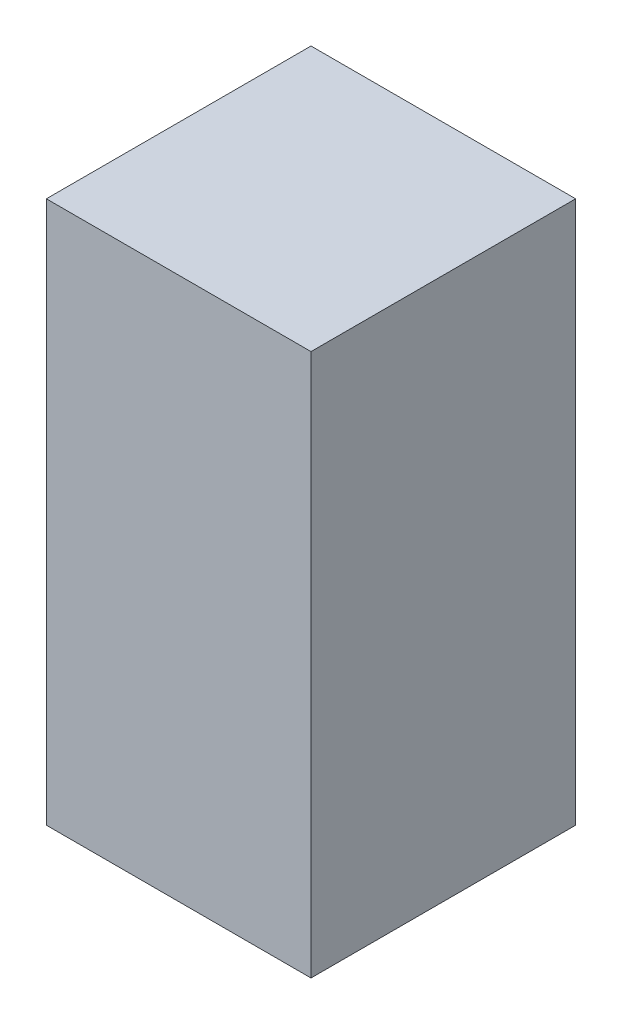
ISO-10303-21;
HEADER;
FILE_DESCRIPTION(('STEP AP214'),'2;1');
FILE_NAME('part.step','',(''),(''),'','','');
FILE_SCHEMA(('AUTOMOTIVE_DESIGN { 1 0 10303 214 1 1 1 1 }'));
ENDSEC;
DATA;
#1=APPLICATION_CONTEXT('core data for automotive mechanical design processes');
#2=APPLICATION_PROTOCOL_DEFINITION('international standard','automotive_design',2000,#1);
#3=PRODUCT_CONTEXT('',#1,'mechanical');
#4=PRODUCT('Part','Part','',(#3));
#5=PRODUCT_RELATED_PRODUCT_CATEGORY('part','',(#4));
#6=PRODUCT_DEFINITION_FORMATION('','',#4);
#7=PRODUCT_DEFINITION_CONTEXT('part definition',#1,'design');
#8=PRODUCT_DEFINITION('design','',#6,#7);
#9=PRODUCT_DEFINITION_SHAPE('','',#8);
#10=(LENGTH_UNIT() NAMED_UNIT(*) SI_UNIT(.MILLI.,.METRE.));
#11=(NAMED_UNIT(*) PLANE_ANGLE_UNIT() SI_UNIT($,.RADIAN.));
#12=(NAMED_UNIT(*) SI_UNIT($,.STERADIAN.) SOLID_ANGLE_UNIT());
#13=UNCERTAINTY_MEASURE_WITH_UNIT(LENGTH_MEASURE(1.E-05),#10,'distance_accuracy_value','');
#14=(GEOMETRIC_REPRESENTATION_CONTEXT(3) GLOBAL_UNCERTAINTY_ASSIGNED_CONTEXT((#13)) GLOBAL_UNIT_ASSIGNED_CONTEXT((#10,
#11,#12)) REPRESENTATION_CONTEXT('',''));
#15=CARTESIAN_POINT('',(0.,0.,0.));
#16=DIRECTION('',(0.,0.,1.));
#17=DIRECTION('',(1.,0.,0.));
#18=AXIS2_PLACEMENT_3D('',#15,#16,#17);
#19=CARTESIAN_POINT('',(2.,2.05,-1.));
#20=DIRECTION('',(0.,0.,1.));
#21=DIRECTION('',(0.,-1.,0.));
#22=AXIS2_PLACEMENT_3D('',#19,#20,#21);
#23=PLANE('',#22);
#24=DIRECTION('',(0.,1.,0.));
#25=VECTOR('',#24,1.);
#26=CARTESIAN_POINT('',(0.,2.05,-1.));
#27=LINE('',#26,#25);
#28=CARTESIAN_POINT('',(0.,-2.05,-1.));
#29=VERTEX_POINT('',#28);
#30=CARTESIAN_POINT('',(0.,2.05,-1.));
#31=VERTEX_POINT('',#30);
#32=EDGE_CURVE('E100',#29,#31,#27,.T.);
#33=ORIENTED_EDGE('',*,*,#32,.T.);
#34=DIRECTION('',(-1.,0.,0.));
#35=VECTOR('',#34,1.);
#36=CARTESIAN_POINT('',(2.,2.05,-1.));
#37=LINE('',#36,#35);
#38=CARTESIAN_POINT('',(2.,2.05,-1.));
#39=VERTEX_POINT('',#38);
#40=EDGE_CURVE('E11',#39,#31,#37,.T.);
#41=ORIENTED_EDGE('',*,*,#40,.F.);
#42=DIRECTION('',(0.,1.,0.));
#43=VECTOR('',#42,1.);
#44=CARTESIAN_POINT('',(2.,2.05,-1.));
#45=LINE('',#44,#43);
#46=CARTESIAN_POINT('',(2.,-2.05,-1.));
#47=VERTEX_POINT('',#46);
#48=EDGE_CURVE('E88',#47,#39,#45,.T.);
#49=ORIENTED_EDGE('',*,*,#48,.F.);
#50=DIRECTION('',(-1.,0.,0.));
#51=VECTOR('',#50,1.);
#52=CARTESIAN_POINT('',(2.,-2.05,-1.));
#53=LINE('',#52,#51);
#54=EDGE_CURVE('E96',#47,#29,#53,.T.);
#55=ORIENTED_EDGE('',*,*,#54,.T.);
#56=EDGE_LOOP('',(#33,#41,#49,#55));
#57=FACE_BOUND('',#56,.T.);
#58=ADVANCED_FACE('F37',(#57),#23,.F.);
#59=CARTESIAN_POINT('',(2.,2.05,1.));
#60=DIRECTION('',(0.,-1.,0.));
#61=DIRECTION('',(0.,0.,-1.));
#62=AXIS2_PLACEMENT_3D('',#59,#60,#61);
#63=PLANE('',#62);
#64=DIRECTION('',(0.,0.,1.));
#65=VECTOR('',#64,1.);
#66=CARTESIAN_POINT('',(0.,2.05,1.));
#67=LINE('',#66,#65);
#68=CARTESIAN_POINT('',(0.,2.05,1.));
#69=VERTEX_POINT('',#68);
#70=EDGE_CURVE('E92',#31,#69,#67,.T.);
#71=ORIENTED_EDGE('',*,*,#70,.T.);
#72=DIRECTION('',(-1.,0.,0.));
#73=VECTOR('',#72,1.);
#74=CARTESIAN_POINT('',(2.,2.05,1.));
#75=LINE('',#74,#73);
#76=CARTESIAN_POINT('',(2.,2.05,1.));
#77=VERTEX_POINT('',#76);
#78=EDGE_CURVE('E45',#77,#69,#75,.T.);
#79=ORIENTED_EDGE('',*,*,#78,.F.);
#80=DIRECTION('',(0.,0.,1.));
#81=VECTOR('',#80,1.);
#82=CARTESIAN_POINT('',(2.,2.05,1.));
#83=LINE('',#82,#81);
#84=EDGE_CURVE('E83',#39,#77,#83,.T.);
#85=ORIENTED_EDGE('',*,*,#84,.F.);
#86=ORIENTED_EDGE('',*,*,#40,.T.);
#87=EDGE_LOOP('',(#71,#79,#85,#86));
#88=FACE_BOUND('',#87,.T.);
#89=ADVANCED_FACE('F91',(#88),#63,.F.);
#90=CARTESIAN_POINT('',(2.,2.05,1.));
#91=DIRECTION('',(0.,0.,-1.));
#92=DIRECTION('',(0.,1.,0.));
#93=AXIS2_PLACEMENT_3D('',#90,#91,#92);
#94=PLANE('',#93);
#95=DIRECTION('',(0.,-1.,0.));
#96=VECTOR('',#95,1.);
#97=CARTESIAN_POINT('',(0.,2.05,1.));
#98=LINE('',#97,#96);
#99=CARTESIAN_POINT('',(0.,-2.05,1.));
#100=VERTEX_POINT('',#99);
#101=EDGE_CURVE('E70',#69,#100,#98,.T.);
#102=ORIENTED_EDGE('',*,*,#101,.T.);
#103=DIRECTION('',(-1.,0.,0.));
#104=VECTOR('',#103,1.);
#105=CARTESIAN_POINT('',(2.,-2.05,1.));
#106=LINE('',#105,#104);
#107=CARTESIAN_POINT('',(2.,-2.05,1.));
#108=VERTEX_POINT('',#107);
#109=EDGE_CURVE('E93',#108,#100,#106,.T.);
#110=ORIENTED_EDGE('',*,*,#109,.F.);
#111=DIRECTION('',(0.,-1.,0.));
#112=VECTOR('',#111,1.);
#113=CARTESIAN_POINT('',(2.,2.05,1.));
#114=LINE('',#113,#112);
#115=EDGE_CURVE('E86',#77,#108,#114,.T.);
#116=ORIENTED_EDGE('',*,*,#115,.F.);
#117=ORIENTED_EDGE('',*,*,#78,.T.);
#118=EDGE_LOOP('',(#102,#110,#116,#117));
#119=FACE_BOUND('',#118,.T.);
#120=ADVANCED_FACE('F94',(#119),#94,.F.);
#121=CARTESIAN_POINT('',(2.,-2.05,1.));
#122=DIRECTION('',(0.,1.,0.));
#123=DIRECTION('',(0.,0.,1.));
#124=AXIS2_PLACEMENT_3D('',#121,#122,#123);
#125=PLANE('',#124);
#126=DIRECTION('',(0.,0.,-1.));
#127=VECTOR('',#126,1.);
#128=CARTESIAN_POINT('',(0.,-2.05,1.));
#129=LINE('',#128,#127);
#130=EDGE_CURVE('E76',#100,#29,#129,.T.);
#131=ORIENTED_EDGE('',*,*,#130,.T.);
#132=ORIENTED_EDGE('',*,*,#54,.F.);
#133=DIRECTION('',(0.,0.,-1.));
#134=VECTOR('',#133,1.);
#135=CARTESIAN_POINT('',(2.,-2.05,1.));
#136=LINE('',#135,#134);
#137=EDGE_CURVE('E53',#108,#47,#136,.T.);
#138=ORIENTED_EDGE('',*,*,#137,.F.);
#139=ORIENTED_EDGE('',*,*,#109,.T.);
#140=EDGE_LOOP('',(#131,#132,#138,#139));
#141=FACE_BOUND('',#140,.T.);
#142=ADVANCED_FACE('F107',(#141),#125,.F.);
#143=CARTESIAN_POINT('',(2.,0.,0.));
#144=DIRECTION('',(1.,0.,0.));
#145=DIRECTION('',(0.,0.,-1.));
#146=AXIS2_PLACEMENT_3D('',#143,#144,#145);
#147=PLANE('',#146);
#148=ORIENTED_EDGE('',*,*,#48,.T.);
#149=ORIENTED_EDGE('',*,*,#84,.T.);
#150=ORIENTED_EDGE('',*,*,#115,.T.);
#151=ORIENTED_EDGE('',*,*,#137,.T.);
#152=EDGE_LOOP('',(#148,#149,#150,#151));
#153=FACE_BOUND('',#152,.T.);
#154=ADVANCED_FACE('F84',(#153),#147,.T.);
#155=CARTESIAN_POINT('',(0.,0.,0.));
#156=DIRECTION('',(1.,0.,0.));
#157=DIRECTION('',(0.,0.,-1.));
#158=AXIS2_PLACEMENT_3D('',#155,#156,#157);
#159=PLANE('',#158);
#160=ORIENTED_EDGE('',*,*,#32,.F.);
#161=ORIENTED_EDGE('',*,*,#130,.F.);
#162=ORIENTED_EDGE('',*,*,#101,.F.);
#163=ORIENTED_EDGE('',*,*,#70,.F.);
#164=EDGE_LOOP('',(#160,#161,#162,#163));
#165=FACE_BOUND('',#164,.T.);
#166=ADVANCED_FACE('F110',(#165),#159,.F.);
#167=CLOSED_SHELL('',(#58,#89,#120,#142,#154,#166));
#168=MANIFOLD_SOLID_BREP('B2',#167);
#169=ADVANCED_BREP_SHAPE_REPRESENTATION('',(#18,#168),#14);
#170=SHAPE_DEFINITION_REPRESENTATION(#9,#169);
ENDSEC;
END-ISO-10303-21;
